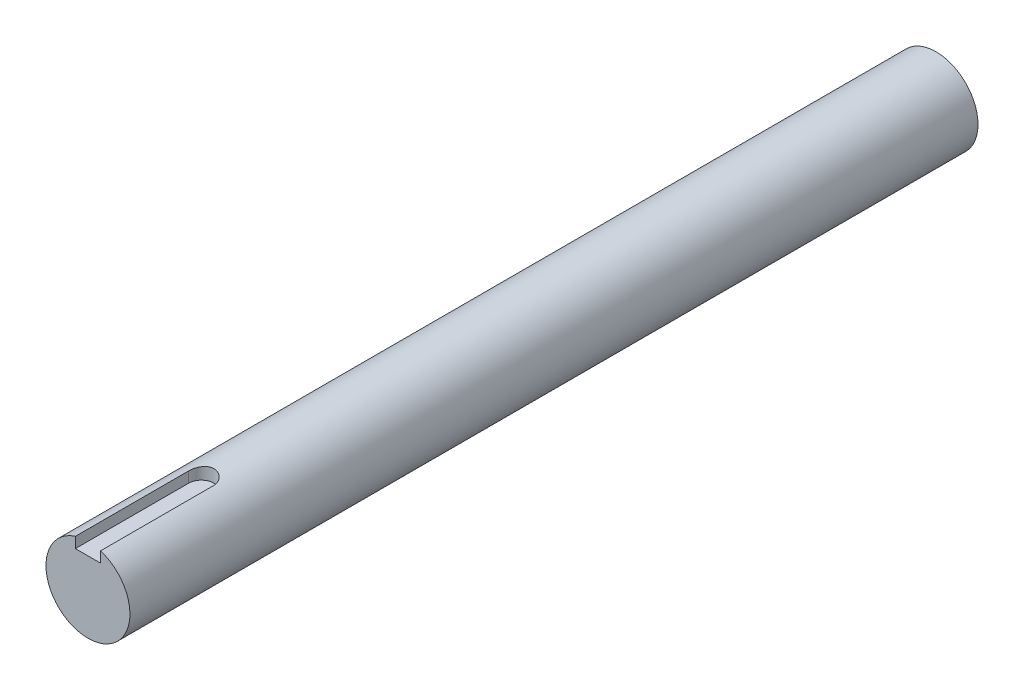
ISO-10303-21;
HEADER;
FILE_DESCRIPTION(('STEP AP214'),'2;1');
FILE_NAME('part.step','',(''),(''),'','','');
FILE_SCHEMA(('AUTOMOTIVE_DESIGN { 1 0 10303 214 1 1 1 1 }'));
ENDSEC;
DATA;
#1=APPLICATION_CONTEXT('core data for automotive mechanical design processes');
#2=APPLICATION_PROTOCOL_DEFINITION('international standard','automotive_design',2000,#1);
#3=PRODUCT_CONTEXT('',#1,'mechanical');
#4=PRODUCT('Part','Part','',(#3));
#5=PRODUCT_RELATED_PRODUCT_CATEGORY('part','',(#4));
#6=PRODUCT_DEFINITION_FORMATION('','',#4);
#7=PRODUCT_DEFINITION_CONTEXT('part definition',#1,'design');
#8=PRODUCT_DEFINITION('design','',#6,#7);
#9=PRODUCT_DEFINITION_SHAPE('','',#8);
#10=(LENGTH_UNIT() NAMED_UNIT(*) SI_UNIT(.MILLI.,.METRE.));
#11=(NAMED_UNIT(*) PLANE_ANGLE_UNIT() SI_UNIT($,.RADIAN.));
#12=(NAMED_UNIT(*) SI_UNIT($,.STERADIAN.) SOLID_ANGLE_UNIT());
#13=UNCERTAINTY_MEASURE_WITH_UNIT(LENGTH_MEASURE(1.E-05),#10,'distance_accuracy_value','');
#14=(GEOMETRIC_REPRESENTATION_CONTEXT(3) GLOBAL_UNCERTAINTY_ASSIGNED_CONTEXT((#13)) GLOBAL_UNIT_ASSIGNED_CONTEXT((#10,
#11,#12)) REPRESENTATION_CONTEXT('',''));
#15=CARTESIAN_POINT('',(0.,0.,0.));
#16=DIRECTION('',(0.,0.,1.));
#17=DIRECTION('',(1.,0.,0.));
#18=AXIS2_PLACEMENT_3D('',#15,#16,#17);
#19=CARTESIAN_POINT('',(0.,0.,50.5));
#20=DIRECTION('',(0.,0.,-1.));
#21=DIRECTION('',(-1.,0.,0.));
#22=AXIS2_PLACEMENT_3D('',#19,#20,#21);
#23=CYLINDRICAL_SURFACE('',#22,5.);
#24=CARTESIAN_POINT('',(0.,0.,50.5));
#25=DIRECTION('',(0.,0.,1.));
#26=DIRECTION('',(1.,0.,0.));
#27=AXIS2_PLACEMENT_3D('',#24,#25,#26);
#28=CIRCLE('',#27,5.);
#29=CARTESIAN_POINT('',(-1.49999999999999,4.76969600708473,50.5));
#30=VERTEX_POINT('',#29);
#31=CARTESIAN_POINT('',(1.50000000000001,4.76969600708473,50.5));
#32=VERTEX_POINT('',#31);
#33=EDGE_CURVE('E48',#30,#32,#28,.T.);
#34=ORIENTED_EDGE('',*,*,#33,.F.);
#35=DIRECTION('',(0.,0.,-1.));
#36=VECTOR('',#35,1.);
#37=CARTESIAN_POINT('',(-1.49999999999999,4.76969600708473,50.5));
#38=LINE('',#37,#36);
#39=CARTESIAN_POINT('',(-1.5,4.76969600708473,37.));
#40=VERTEX_POINT('',#39);
#41=EDGE_CURVE('E102',#30,#40,#38,.T.);
#42=ORIENTED_EDGE('',*,*,#41,.T.);
#43=CARTESIAN_POINT('',(-1.5,4.76969600708473,37.));
#44=CARTESIAN_POINT('',(-1.50000085357071,4.76969249084934,36.958820607092));
#45=CARTESIAN_POINT('',(-1.49830317083428,4.77022997000129,36.9176619568739));
#46=CARTESIAN_POINT('',(-1.49153785660317,4.77235095109999,36.8356588379044));
#47=CARTESIAN_POINT('',(-1.48647098275841,4.77393421787376,36.7948143006051));
#48=CARTESIAN_POINT('',(-1.46630203689311,4.78018490618873,36.6734094590453));
#49=CARTESIAN_POINT('',(-1.44623120413662,4.78635370384275,36.5936936095836));
#50=CARTESIAN_POINT('',(-1.39353102315626,4.80195952113208,36.4389644216141));
#51=CARTESIAN_POINT('',(-1.36090607068203,4.81139539670393,36.3639494478019));
#52=CARTESIAN_POINT('',(-1.28407841117656,4.83246571212052,36.2204033184024));
#53=CARTESIAN_POINT('',(-1.23987031651226,4.84410117434933,36.1518752002716));
#54=CARTESIAN_POINT('',(-1.13964850658326,4.86866835244721,36.021133944003));
#55=CARTESIAN_POINT('',(-1.08333433465208,4.88162755412974,35.9591563396566));
#56=CARTESIAN_POINT('',(-0.961138919873354,4.90714811559049,35.8453644161));
#57=CARTESIAN_POINT('',(-0.895256063916348,4.91970940785249,35.793551813997));
#58=CARTESIAN_POINT('',(-0.754109921315429,4.94333239727705,35.7005362296815));
#59=CARTESIAN_POINT('',(-0.678680819336258,4.95435770971354,35.6595748197021));
#60=CARTESIAN_POINT('',(-0.521621185505772,4.97334469846208,35.5910115883818));
#61=CARTESIAN_POINT('',(-0.439992259012925,4.98130716463903,35.5634063222057));
#62=CARTESIAN_POINT('',(-0.275324697874876,4.99307639935002,35.523120200898));
#63=CARTESIAN_POINT('',(-0.192393125294251,4.99699549276993,35.5100351420303));
#64=CARTESIAN_POINT('',(-0.0254235719980804,5.00063202022426,35.4978826586367));
#65=CARTESIAN_POINT('',(0.0586141962423635,5.00035024971471,35.4988125802998));
#66=CARTESIAN_POINT('',(0.222571599946017,4.99569602566267,35.514392908759));
#67=CARTESIAN_POINT('',(0.302537145464641,4.99145415509187,35.5286053449787));
#68=CARTESIAN_POINT('',(0.458890052102025,4.9795151369998,35.5696316352381));
#69=CARTESIAN_POINT('',(0.535277225531998,4.97181780846028,35.5964461494559));
#70=CARTESIAN_POINT('',(0.683347815892216,4.95365214926145,35.6622122216464));
#71=CARTESIAN_POINT('',(0.754966006044142,4.94315255692525,35.7013016443569));
#72=CARTESIAN_POINT('',(0.89076552957442,4.92049624651755,35.7903985900483));
#73=CARTESIAN_POINT('',(0.954945191614595,4.90833915735884,35.8404085594788));
#74=CARTESIAN_POINT('',(1.07665450541275,4.88311673571409,35.9521919880835));
#75=CARTESIAN_POINT('',(1.13383351478034,4.87003445449554,36.0143438637608));
#76=CARTESIAN_POINT('',(1.23706769492487,4.84484215114658,36.1474974234279));
#77=CARTESIAN_POINT('',(1.28311962013077,4.83273241337565,36.2185016803655));
#78=CARTESIAN_POINT('',(1.36316407240863,4.81077228795653,36.3682809284493));
#79=CARTESIAN_POINT('',(1.39703006341135,4.80094596245948,36.4471271795934));
#80=CARTESIAN_POINT('',(1.45085886004699,4.78495663653201,36.6097245039817));
#81=CARTESIAN_POINT('',(1.47084293218035,4.77878803475875,36.6934678607144));
#82=CARTESIAN_POINT('',(1.4890120359008,4.77314032325006,36.8149948890702));
#83=CARTESIAN_POINT('',(1.49313202989009,4.77185156275267,36.8518907341796));
#84=CARTESIAN_POINT('',(1.49862355614854,4.77012928611782,36.9258514790995));
#85=CARTESIAN_POINT('',(1.49999912968269,4.76969451246644,36.9629160496639));
#86=CARTESIAN_POINT('',(1.5,4.76969600708473,37.));
#87=B_SPLINE_CURVE_WITH_KNOTS('',3,(#43,#44,#45,#46,#47,#48,#49,#50,#51,#52,#53,#54,#55,#56,#57,
#58,#59,#60,#61,#62,#63,#64,#65,#66,#67,#68,#69,#70,#71,#72,#73,#74,#75,#76,#77,#78,#79,#80,#81,
#82,#83,#84,#85,#86),.UNSPECIFIED.,.F.,.F.,(4,2,2,2,2,2,2,2,2,2,2,2,2,2,2,2,2,2,2,2,2,4),(0.,
0.123459071219744,0.246890388853047,0.492911349615211,0.738846245884322,0.984895736828089,
1.23795510798803,1.49105719006936,1.74939356197455,2.00766326783256,2.25854751319802,
2.5093842528947,2.75223130012966,2.99509107067836,3.2407824256273,3.48652887757005,
3.74172568310981,3.99699683536778,4.25484698071527,4.51230123440207,4.62365084745809,
4.73483637253616),.UNSPECIFIED.);
#88=CARTESIAN_POINT('',(1.5,4.76969600708473,37.));
#89=VERTEX_POINT('',#88);
#90=EDGE_CURVE('E11',#40,#89,#87,.T.);
#91=ORIENTED_EDGE('',*,*,#90,.T.);
#92=DIRECTION('',(0.,0.,-1.));
#93=VECTOR('',#92,1.);
#94=CARTESIAN_POINT('',(1.50000000000001,4.76969600708473,50.5));
#95=LINE('',#94,#93);
#96=EDGE_CURVE('E63',#89,#32,#95,.F.);
#97=ORIENTED_EDGE('',*,*,#96,.T.);
#98=EDGE_LOOP('',(#34,#42,#91,#97));
#99=FACE_BOUND('',#98,.T.);
#100=CARTESIAN_POINT('',(0.,0.,-50.5));
#101=DIRECTION('',(0.,0.,1.));
#102=DIRECTION('',(1.,0.,0.));
#103=AXIS2_PLACEMENT_3D('',#100,#101,#102);
#104=CIRCLE('',#103,5.);
#105=CARTESIAN_POINT('',(5.,0.,-50.5));
#106=VERTEX_POINT('',#105);
#107=EDGE_CURVE('E110',#106,#106,#104,.T.);
#108=ORIENTED_EDGE('',*,*,#107,.T.);
#109=EDGE_LOOP('',(#108));
#110=FACE_BOUND('',#109,.T.);
#111=ADVANCED_FACE('F35',(#99,#110),#23,.T.);
#112=CARTESIAN_POINT('',(0.,0.,50.5));
#113=DIRECTION('',(0.,0.,1.));
#114=DIRECTION('',(1.,0.,0.));
#115=AXIS2_PLACEMENT_3D('',#112,#113,#114);
#116=PLANE('',#115);
#117=DIRECTION('',(0.,1.,0.));
#118=VECTOR('',#117,1.);
#119=CARTESIAN_POINT('',(1.50000000000001,3.5,50.5));
#120=LINE('',#119,#118);
#121=CARTESIAN_POINT('',(1.50000000000001,3.5,50.5));
#122=VERTEX_POINT('',#121);
#123=EDGE_CURVE('E100',#122,#32,#120,.T.);
#124=ORIENTED_EDGE('',*,*,#123,.F.);
#125=DIRECTION('',(1.,0.,0.));
#126=VECTOR('',#125,1.);
#127=CARTESIAN_POINT('',(-1.49999999999999,3.5,50.5));
#128=LINE('',#127,#126);
#129=CARTESIAN_POINT('',(-1.5,3.5,50.5));
#130=VERTEX_POINT('',#129);
#131=EDGE_CURVE('E87',#130,#122,#128,.T.);
#132=ORIENTED_EDGE('',*,*,#131,.F.);
#133=DIRECTION('',(0.,1.,0.));
#134=VECTOR('',#133,1.);
#135=CARTESIAN_POINT('',(-1.49999999999999,3.5,50.5));
#136=LINE('',#135,#134);
#137=EDGE_CURVE('E103',#130,#30,#136,.T.);
#138=ORIENTED_EDGE('',*,*,#137,.T.);
#139=ORIENTED_EDGE('',*,*,#33,.T.);
#140=EDGE_LOOP('',(#124,#132,#138,#139));
#141=FACE_BOUND('',#140,.T.);
#142=ADVANCED_FACE('F118',(#141),#116,.T.);
#143=CARTESIAN_POINT('',(0.,0.,-50.5));
#144=DIRECTION('',(0.,0.,1.));
#145=DIRECTION('',(1.,0.,0.));
#146=AXIS2_PLACEMENT_3D('',#143,#144,#145);
#147=PLANE('',#146);
#148=ORIENTED_EDGE('',*,*,#107,.F.);
#149=EDGE_LOOP('',(#148));
#150=FACE_BOUND('',#149,.T.);
#151=ADVANCED_FACE('F116',(#150),#147,.F.);
#152=CARTESIAN_POINT('',(0.,3.5,37.));
#153=DIRECTION('',(0.,1.,0.));
#154=DIRECTION('',(0.,0.,1.));
#155=AXIS2_PLACEMENT_3D('',#152,#153,#154);
#156=CYLINDRICAL_SURFACE('',#155,1.5);
#157=DIRECTION('',(0.,1.,0.));
#158=VECTOR('',#157,1.);
#159=CARTESIAN_POINT('',(-1.5,3.5,37.));
#160=LINE('',#159,#158);
#161=CARTESIAN_POINT('',(-1.5,3.5,37.));
#162=VERTEX_POINT('',#161);
#163=EDGE_CURVE('E86',#162,#40,#160,.T.);
#164=ORIENTED_EDGE('',*,*,#163,.F.);
#165=CARTESIAN_POINT('',(0.,3.5,37.));
#166=DIRECTION('',(0.,1.,0.));
#167=DIRECTION('',(0.,0.,-1.));
#168=AXIS2_PLACEMENT_3D('',#165,#166,#167);
#169=CIRCLE('',#168,1.5);
#170=CARTESIAN_POINT('',(1.5,3.5,37.));
#171=VERTEX_POINT('',#170);
#172=EDGE_CURVE('E89',#171,#162,#169,.T.);
#173=ORIENTED_EDGE('',*,*,#172,.F.);
#174=DIRECTION('',(0.,1.,0.));
#175=VECTOR('',#174,1.);
#176=CARTESIAN_POINT('',(1.5,3.5,37.));
#177=LINE('',#176,#175);
#178=EDGE_CURVE('E80',#171,#89,#177,.T.);
#179=ORIENTED_EDGE('',*,*,#178,.T.);
#180=ORIENTED_EDGE('',*,*,#90,.F.);
#181=EDGE_LOOP('',(#164,#173,#179,#180));
#182=FACE_BOUND('',#181,.T.);
#183=ADVANCED_FACE('F90',(#182),#156,.F.);
#184=CARTESIAN_POINT('',(1.5,3.5,37.));
#185=DIRECTION('',(1.,0.,0.));
#186=DIRECTION('',(0.,0.,-1.));
#187=AXIS2_PLACEMENT_3D('',#184,#185,#186);
#188=PLANE('',#187);
#189=ORIENTED_EDGE('',*,*,#178,.F.);
#190=DIRECTION('',(0.,0.,-1.));
#191=VECTOR('',#190,1.);
#192=CARTESIAN_POINT('',(1.5,3.5,37.));
#193=LINE('',#192,#191);
#194=EDGE_CURVE('E84',#122,#171,#193,.T.);
#195=ORIENTED_EDGE('',*,*,#194,.F.);
#196=ORIENTED_EDGE('',*,*,#123,.T.);
#197=ORIENTED_EDGE('',*,*,#96,.F.);
#198=EDGE_LOOP('',(#189,#195,#196,#197));
#199=FACE_BOUND('',#198,.T.);
#200=ADVANCED_FACE('F82',(#199),#188,.F.);
#201=CARTESIAN_POINT('',(-1.5,3.5,37.));
#202=DIRECTION('',(-1.,0.,0.));
#203=DIRECTION('',(0.,0.,1.));
#204=AXIS2_PLACEMENT_3D('',#201,#202,#203);
#205=PLANE('',#204);
#206=ORIENTED_EDGE('',*,*,#137,.F.);
#207=DIRECTION('',(0.,0.,1.));
#208=VECTOR('',#207,1.);
#209=CARTESIAN_POINT('',(-1.5,3.5,37.));
#210=LINE('',#209,#208);
#211=EDGE_CURVE('E55',#162,#130,#210,.T.);
#212=ORIENTED_EDGE('',*,*,#211,.F.);
#213=ORIENTED_EDGE('',*,*,#163,.T.);
#214=ORIENTED_EDGE('',*,*,#41,.F.);
#215=EDGE_LOOP('',(#206,#212,#213,#214));
#216=FACE_BOUND('',#215,.T.);
#217=ADVANCED_FACE('F131',(#216),#205,.F.);
#218=CARTESIAN_POINT('',(0.,3.5,37.));
#219=DIRECTION('',(0.,-1.,0.));
#220=DIRECTION('',(0.,0.,-1.));
#221=AXIS2_PLACEMENT_3D('',#218,#219,#220);
#222=PLANE('',#221);
#223=ORIENTED_EDGE('',*,*,#194,.T.);
#224=ORIENTED_EDGE('',*,*,#172,.T.);
#225=ORIENTED_EDGE('',*,*,#211,.T.);
#226=ORIENTED_EDGE('',*,*,#131,.T.);
#227=EDGE_LOOP('',(#223,#224,#225,#226));
#228=FACE_BOUND('',#227,.T.);
#229=ADVANCED_FACE('F93',(#228),#222,.F.);
#230=CLOSED_SHELL('',(#111,#142,#151,#183,#200,#217,#229));
#231=MANIFOLD_SOLID_BREP('B2',#230);
#232=ADVANCED_BREP_SHAPE_REPRESENTATION('',(#18,#231),#14);
#233=SHAPE_DEFINITION_REPRESENTATION(#9,#232);
ENDSEC;
END-ISO-10303-21;
